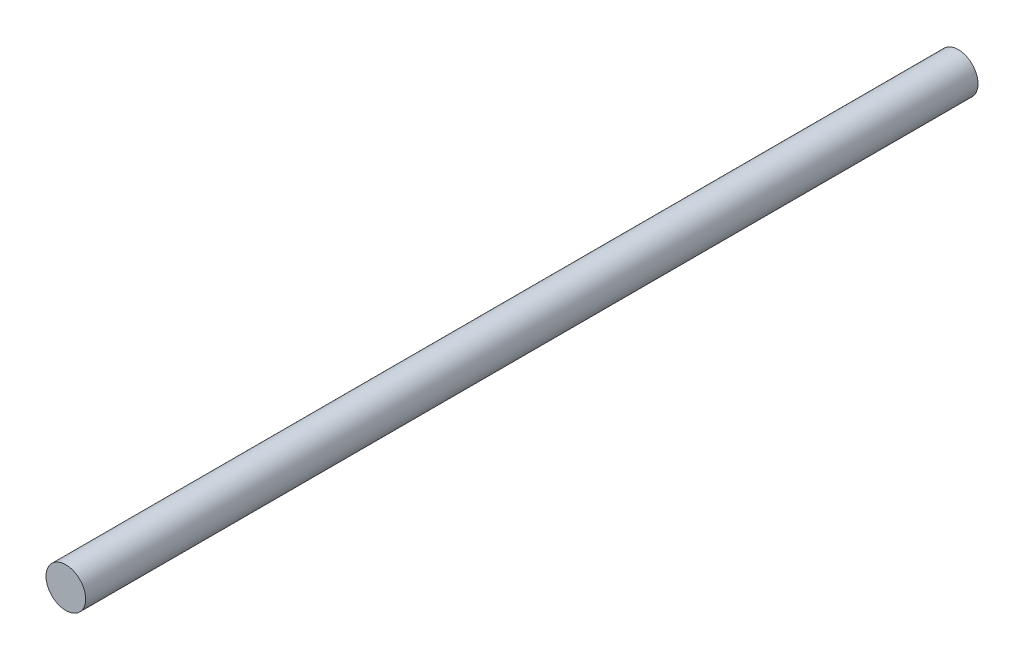
ISO-10303-21;
HEADER;
FILE_DESCRIPTION(('STEP AP214'),'2;1');
FILE_NAME('part.step','',(''),(''),'','','');
FILE_SCHEMA(('AUTOMOTIVE_DESIGN { 1 0 10303 214 1 1 1 1 }'));
ENDSEC;
DATA;
#1=APPLICATION_CONTEXT('core data for automotive mechanical design processes');
#2=APPLICATION_PROTOCOL_DEFINITION('international standard','automotive_design',2000,#1);
#3=PRODUCT_CONTEXT('',#1,'mechanical');
#4=PRODUCT('Part','Part','',(#3));
#5=PRODUCT_RELATED_PRODUCT_CATEGORY('part','',(#4));
#6=PRODUCT_DEFINITION_FORMATION('','',#4);
#7=PRODUCT_DEFINITION_CONTEXT('part definition',#1,'design');
#8=PRODUCT_DEFINITION('design','',#6,#7);
#9=PRODUCT_DEFINITION_SHAPE('','',#8);
#10=(LENGTH_UNIT() NAMED_UNIT(*) SI_UNIT(.MILLI.,.METRE.));
#11=(NAMED_UNIT(*) PLANE_ANGLE_UNIT() SI_UNIT($,.RADIAN.));
#12=(NAMED_UNIT(*) SI_UNIT($,.STERADIAN.) SOLID_ANGLE_UNIT());
#13=UNCERTAINTY_MEASURE_WITH_UNIT(LENGTH_MEASURE(1.E-05),#10,'distance_accuracy_value','');
#14=(GEOMETRIC_REPRESENTATION_CONTEXT(3) GLOBAL_UNCERTAINTY_ASSIGNED_CONTEXT((#13)) GLOBAL_UNIT_ASSIGNED_CONTEXT((#10,
#11,#12)) REPRESENTATION_CONTEXT('',''));
#15=CARTESIAN_POINT('',(0.,0.,0.));
#16=DIRECTION('',(0.,0.,1.));
#17=DIRECTION('',(1.,0.,0.));
#18=AXIS2_PLACEMENT_3D('',#15,#16,#17);
#19=CARTESIAN_POINT('',(0.,0.,180.));
#20=DIRECTION('',(0.,0.,-1.));
#21=DIRECTION('',(-1.,0.,0.));
#22=AXIS2_PLACEMENT_3D('',#19,#20,#21);
#23=CYLINDRICAL_SURFACE('',#22,4.);
#24=CARTESIAN_POINT('',(0.,0.,180.));
#25=DIRECTION('',(0.,0.,1.));
#26=DIRECTION('',(1.,0.,0.));
#27=AXIS2_PLACEMENT_3D('',#24,#25,#26);
#28=CIRCLE('',#27,4.);
#29=CARTESIAN_POINT('',(-4.,0.,180.));
#30=VERTEX_POINT('',#29);
#31=EDGE_CURVE('E10',#30,#30,#28,.T.);
#32=CARTESIAN_POINT('',(0.,0.,0.));
#33=DIRECTION('',(0.,0.,1.));
#34=DIRECTION('',(1.,0.,0.));
#35=AXIS2_PLACEMENT_3D('',#32,#33,#34);
#36=CIRCLE('',#35,4.);
#37=CARTESIAN_POINT('',(-4.,0.,0.));
#38=VERTEX_POINT('',#37);
#39=EDGE_CURVE('E36',#38,#38,#36,.T.);
#40=CARTESIAN_POINT('',(-4.,0.,180.));
#41=CARTESIAN_POINT('',(-4.,0.,178.125));
#42=CARTESIAN_POINT('',(-4.,0.,176.25));
#43=CARTESIAN_POINT('',(-4.,0.,172.5));
#44=CARTESIAN_POINT('',(-4.,0.,170.625));
#45=CARTESIAN_POINT('',(-4.,0.,166.875));
#46=CARTESIAN_POINT('',(-4.,0.,165.));
#47=CARTESIAN_POINT('',(-4.,0.,161.25));
#48=CARTESIAN_POINT('',(-4.,0.,159.375));
#49=CARTESIAN_POINT('',(-4.,0.,155.625));
#50=CARTESIAN_POINT('',(-4.,0.,153.75));
#51=CARTESIAN_POINT('',(-4.,0.,150.));
#52=CARTESIAN_POINT('',(-4.,0.,148.125));
#53=CARTESIAN_POINT('',(-4.,0.,144.375));
#54=CARTESIAN_POINT('',(-4.,0.,142.5));
#55=CARTESIAN_POINT('',(-4.,0.,138.75));
#56=CARTESIAN_POINT('',(-4.,0.,136.875));
#57=CARTESIAN_POINT('',(-4.,0.,133.125));
#58=CARTESIAN_POINT('',(-4.,0.,131.25));
#59=CARTESIAN_POINT('',(-4.,0.,127.5));
#60=CARTESIAN_POINT('',(-4.,0.,125.625));
#61=CARTESIAN_POINT('',(-4.,0.,121.875));
#62=CARTESIAN_POINT('',(-4.,0.,120.));
#63=CARTESIAN_POINT('',(-4.,0.,116.25));
#64=CARTESIAN_POINT('',(-4.,0.,114.375));
#65=CARTESIAN_POINT('',(-4.,0.,110.625));
#66=CARTESIAN_POINT('',(-4.,0.,108.75));
#67=CARTESIAN_POINT('',(-4.,0.,105.));
#68=CARTESIAN_POINT('',(-4.,0.,103.125));
#69=CARTESIAN_POINT('',(-4.,0.,99.375));
#70=CARTESIAN_POINT('',(-4.,0.,97.5));
#71=CARTESIAN_POINT('',(-4.,0.,93.75));
#72=CARTESIAN_POINT('',(-4.,0.,91.875));
#73=CARTESIAN_POINT('',(-4.,0.,88.125));
#74=CARTESIAN_POINT('',(-4.,0.,86.25));
#75=CARTESIAN_POINT('',(-4.,0.,82.5));
#76=CARTESIAN_POINT('',(-4.,0.,80.625));
#77=CARTESIAN_POINT('',(-4.,0.,76.875));
#78=CARTESIAN_POINT('',(-4.,0.,75.));
#79=CARTESIAN_POINT('',(-4.,0.,71.25));
#80=CARTESIAN_POINT('',(-4.,0.,69.375));
#81=CARTESIAN_POINT('',(-4.,0.,65.625));
#82=CARTESIAN_POINT('',(-4.,0.,63.75));
#83=CARTESIAN_POINT('',(-4.,0.,60.));
#84=CARTESIAN_POINT('',(-4.,0.,58.125));
#85=CARTESIAN_POINT('',(-4.,0.,54.375));
#86=CARTESIAN_POINT('',(-4.,0.,52.5));
#87=CARTESIAN_POINT('',(-4.,0.,48.75));
#88=CARTESIAN_POINT('',(-4.,0.,46.875));
#89=CARTESIAN_POINT('',(-4.,0.,43.125));
#90=CARTESIAN_POINT('',(-4.,0.,41.25));
#91=CARTESIAN_POINT('',(-4.,0.,37.5));
#92=CARTESIAN_POINT('',(-4.,0.,35.625));
#93=CARTESIAN_POINT('',(-4.,0.,31.875));
#94=CARTESIAN_POINT('',(-4.,0.,30.));
#95=CARTESIAN_POINT('',(-4.,0.,26.25));
#96=CARTESIAN_POINT('',(-4.,0.,24.375));
#97=CARTESIAN_POINT('',(-4.,0.,20.625));
#98=CARTESIAN_POINT('',(-4.,0.,18.75));
#99=CARTESIAN_POINT('',(-4.,0.,15.));
#100=CARTESIAN_POINT('',(-4.,0.,13.125));
#101=CARTESIAN_POINT('',(-4.,0.,9.37499999999998));
#102=CARTESIAN_POINT('',(-4.,0.,7.49999999999997));
#103=CARTESIAN_POINT('',(-4.,0.,3.74999999999997));
#104=CARTESIAN_POINT('',(-4.,0.,1.87499999999997));
#105=CARTESIAN_POINT('',(-4.,0.,0.));
#106=B_SPLINE_CURVE_WITH_KNOTS('',3,(#40,#41,#42,#43,#44,#45,#46,#47,#48,#49,#50,#51,#52,#53,
#54,#55,#56,#57,#58,#59,#60,#61,#62,#63,#64,#65,#66,#67,#68,#69,#70,#71,#72,#73,#74,#75,#76,#77,
#78,#79,#80,#81,#82,#83,#84,#85,#86,#87,#88,#89,#90,#91,#92,#93,#94,#95,#96,#97,#98,#99,#100,
#101,#102,#103,#104,#105),.UNSPECIFIED.,.F.,.F.,(4,2,2,2,2,2,2,2,2,2,2,2,2,2,2,2,2,2,2,2,2,2,2,
2,2,2,2,2,2,2,2,2,4),(0.,5.62499999999999,11.25,16.875,22.5,28.125,33.75,39.375,45.,50.625,
56.25,61.875,67.5,73.125,78.75,84.375,90.,95.625,101.25,106.875,112.5,118.125,123.75,129.375,
135.,140.625,146.25,151.875,157.5,163.125,168.75,174.375,180.),.UNSPECIFIED.);
#107=EDGE_CURVE('BSEAM33',#30,#38,#106,.T.);
#108=ORIENTED_EDGE('',*,*,#31,.F.);
#109=ORIENTED_EDGE('',*,*,#39,.T.);
#110=ORIENTED_EDGE('',*,*,#107,.T.);
#111=ORIENTED_EDGE('',*,*,#107,.F.);
#112=EDGE_LOOP('',(#108,#110,#109,#111));
#113=FACE_BOUND('',#112,.T.);
#114=ADVANCED_FACE('F33',(#113),#23,.T.);
#115=CARTESIAN_POINT('',(0.,0.,180.));
#116=DIRECTION('',(0.,0.,1.));
#117=DIRECTION('',(1.,0.,0.));
#118=AXIS2_PLACEMENT_3D('',#115,#116,#117);
#119=PLANE('',#118);
#120=ORIENTED_EDGE('',*,*,#31,.T.);
#121=EDGE_LOOP('',(#120));
#122=FACE_BOUND('',#121,.T.);
#123=ADVANCED_FACE('F48',(#122),#119,.T.);
#124=CARTESIAN_POINT('',(0.,0.,0.));
#125=DIRECTION('',(0.,0.,1.));
#126=DIRECTION('',(1.,0.,0.));
#127=AXIS2_PLACEMENT_3D('',#124,#125,#126);
#128=PLANE('',#127);
#129=ORIENTED_EDGE('',*,*,#39,.F.);
#130=EDGE_LOOP('',(#129));
#131=FACE_BOUND('',#130,.T.);
#132=ADVANCED_FACE('F46',(#131),#128,.F.);
#133=CLOSED_SHELL('',(#114,#123,#132));
#134=MANIFOLD_SOLID_BREP('B2',#133);
#135=ADVANCED_BREP_SHAPE_REPRESENTATION('',(#18,#134),#14);
#136=SHAPE_DEFINITION_REPRESENTATION(#9,#135);
ENDSEC;
END-ISO-10303-21;
